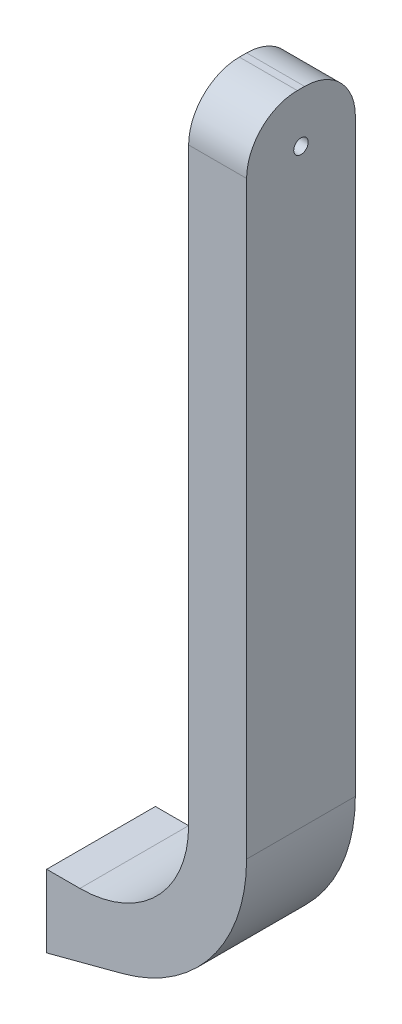
ISO-10303-21;
HEADER;
FILE_DESCRIPTION(('STEP AP214'),'2;1');
FILE_NAME('part.step','',(''),(''),'','','');
FILE_SCHEMA(('AUTOMOTIVE_DESIGN { 1 0 10303 214 1 1 1 1 }'));
ENDSEC;
DATA;
#1=APPLICATION_CONTEXT('core data for automotive mechanical design processes');
#2=APPLICATION_PROTOCOL_DEFINITION('international standard','automotive_design',2000,#1);
#3=PRODUCT_CONTEXT('',#1,'mechanical');
#4=PRODUCT('Part','Part','',(#3));
#5=PRODUCT_RELATED_PRODUCT_CATEGORY('part','',(#4));
#6=PRODUCT_DEFINITION_FORMATION('','',#4);
#7=PRODUCT_DEFINITION_CONTEXT('part definition',#1,'design');
#8=PRODUCT_DEFINITION('design','',#6,#7);
#9=PRODUCT_DEFINITION_SHAPE('','',#8);
#10=(LENGTH_UNIT() NAMED_UNIT(*) SI_UNIT(.MILLI.,.METRE.));
#11=(NAMED_UNIT(*) PLANE_ANGLE_UNIT() SI_UNIT($,.RADIAN.));
#12=(NAMED_UNIT(*) SI_UNIT($,.STERADIAN.) SOLID_ANGLE_UNIT());
#13=UNCERTAINTY_MEASURE_WITH_UNIT(LENGTH_MEASURE(1.E-05),#10,'distance_accuracy_value','');
#14=(GEOMETRIC_REPRESENTATION_CONTEXT(3) GLOBAL_UNCERTAINTY_ASSIGNED_CONTEXT((#13)) GLOBAL_UNIT_ASSIGNED_CONTEXT((#10,
#11,#12)) REPRESENTATION_CONTEXT('',''));
#15=CARTESIAN_POINT('',(0.,0.,0.));
#16=DIRECTION('',(0.,0.,1.));
#17=DIRECTION('',(1.,0.,0.));
#18=AXIS2_PLACEMENT_3D('',#15,#16,#17);
#19=CARTESIAN_POINT('',(96.8142284992855,422.253610620611,-131.630953187279));
#20=DIRECTION('',(-1.,0.,0.));
#21=DIRECTION('',(0.,0.,1.));
#22=AXIS2_PLACEMENT_3D('',#19,#20,#21);
#23=PLANE('',#22);
#24=DIRECTION('',(0.,1.,0.));
#25=VECTOR('',#24,1.);
#26=CARTESIAN_POINT('',(96.8142284992855,422.253610620611,-15.));
#27=LINE('',#26,#25);
#28=CARTESIAN_POINT('',(96.8142284992855,412.253610620621,-15.));
#29=VERTEX_POINT('',#28);
#30=CARTESIAN_POINT('',(96.8142284992855,422.253610620611,-15.));
#31=VERTEX_POINT('',#30);
#32=EDGE_CURVE('E117',#29,#31,#27,.T.);
#33=ORIENTED_EDGE('',*,*,#32,.F.);
#34=DIRECTION('',(0.,0.,1.));
#35=VECTOR('',#34,1.);
#36=CARTESIAN_POINT('',(96.8142284992855,412.253610620621,-131.630953187279));
#37=LINE('',#36,#35);
#38=CARTESIAN_POINT('',(96.8142284992855,412.253610620621,0.));
#39=VERTEX_POINT('',#38);
#40=EDGE_CURVE('E111',#29,#39,#37,.T.);
#41=ORIENTED_EDGE('',*,*,#40,.T.);
#42=DIRECTION('',(0.,-1.,0.));
#43=VECTOR('',#42,1.);
#44=CARTESIAN_POINT('',(96.8142284992855,422.253610620611,0.));
#45=LINE('',#44,#43);
#46=CARTESIAN_POINT('',(96.8142284992855,422.253610620611,0.));
#47=VERTEX_POINT('',#46);
#48=EDGE_CURVE('E115',#47,#39,#45,.T.);
#49=ORIENTED_EDGE('',*,*,#48,.F.);
#50=DIRECTION('',(0.,0.,1.));
#51=VECTOR('',#50,1.);
#52=CARTESIAN_POINT('',(96.8142284992855,422.253610620611,-131.630953187279));
#53=LINE('',#52,#51);
#54=EDGE_CURVE('E152',#31,#47,#53,.T.);
#55=ORIENTED_EDGE('',*,*,#54,.F.);
#56=EDGE_LOOP('',(#33,#41,#49,#55));
#57=FACE_BOUND('',#56,.T.);
#58=ADVANCED_FACE('F33',(#57),#23,.T.);
#59=CARTESIAN_POINT('',(96.8142284992855,422.253610620611,-131.630953187279));
#60=DIRECTION('',(0.,1.,0.));
#61=DIRECTION('',(0.,0.,1.));
#62=AXIS2_PLACEMENT_3D('',#59,#60,#61);
#63=PLANE('',#62);
#64=DIRECTION('',(1.,0.,0.));
#65=VECTOR('',#64,1.);
#66=CARTESIAN_POINT('',(96.8142284992855,422.253610620611,-15.));
#67=LINE('',#66,#65);
#68=CARTESIAN_POINT('',(101.396155955386,422.253610620611,-15.));
#69=VERTEX_POINT('',#68);
#70=EDGE_CURVE('E213',#31,#69,#67,.T.);
#71=ORIENTED_EDGE('',*,*,#70,.F.);
#72=ORIENTED_EDGE('',*,*,#54,.T.);
#73=DIRECTION('',(-1.,0.,0.));
#74=VECTOR('',#73,1.);
#75=CARTESIAN_POINT('',(96.8142284992855,422.253610620611,0.));
#76=LINE('',#75,#74);
#77=CARTESIAN_POINT('',(101.396155955386,422.253610620611,0.));
#78=VERTEX_POINT('',#77);
#79=EDGE_CURVE('E121',#78,#47,#76,.T.);
#80=ORIENTED_EDGE('',*,*,#79,.F.);
#81=DIRECTION('',(0.,0.,1.));
#82=VECTOR('',#81,1.);
#83=CARTESIAN_POINT('',(101.396155955386,422.253610620611,-131.630953187279));
#84=LINE('',#83,#82);
#85=EDGE_CURVE('E155',#69,#78,#84,.T.);
#86=ORIENTED_EDGE('',*,*,#85,.F.);
#87=EDGE_LOOP('',(#71,#72,#80,#86));
#88=FACE_BOUND('',#87,.T.);
#89=ADVANCED_FACE('F217',(#88),#63,.T.);
#90=CARTESIAN_POINT('',(101.396155955386,437.253610620611,-131.630953187279));
#91=DIRECTION('',(0.,0.,1.));
#92=DIRECTION('',(1.,0.,0.));
#93=AXIS2_PLACEMENT_3D('',#90,#91,#92);
#94=CYLINDRICAL_SURFACE('',#93,15.);
#95=CARTESIAN_POINT('',(101.396155955386,437.253610620611,-15.));
#96=DIRECTION('',(0.,0.,1.));
#97=DIRECTION('',(1.,0.,0.));
#98=AXIS2_PLACEMENT_3D('',#95,#96,#97);
#99=CIRCLE('',#98,15.);
#100=CARTESIAN_POINT('',(116.396155955386,437.253610620611,-15.));
#101=VERTEX_POINT('',#100);
#102=EDGE_CURVE('E194',#69,#101,#99,.T.);
#103=ORIENTED_EDGE('',*,*,#102,.F.);
#104=ORIENTED_EDGE('',*,*,#85,.T.);
#105=CARTESIAN_POINT('',(101.396155955386,437.253610620611,0.));
#106=DIRECTION('',(0.,0.,-1.));
#107=DIRECTION('',(1.,0.,0.));
#108=AXIS2_PLACEMENT_3D('',#105,#106,#107);
#109=CIRCLE('',#108,15.);
#110=CARTESIAN_POINT('',(116.396155955386,437.253610620611,0.));
#111=VERTEX_POINT('',#110);
#112=EDGE_CURVE('E149',#111,#78,#109,.T.);
#113=ORIENTED_EDGE('',*,*,#112,.F.);
#114=DIRECTION('',(0.,0.,1.));
#115=VECTOR('',#114,1.);
#116=CARTESIAN_POINT('',(116.396155955386,437.253610620611,-131.630953187279));
#117=LINE('',#116,#115);
#118=EDGE_CURVE('E157',#101,#111,#117,.T.);
#119=ORIENTED_EDGE('',*,*,#118,.F.);
#120=EDGE_LOOP('',(#103,#104,#113,#119));
#121=FACE_BOUND('',#120,.T.);
#122=ADVANCED_FACE('F220',(#121),#94,.F.);
#123=CARTESIAN_POINT('',(116.396155955386,437.253610620611,-131.630953187279));
#124=DIRECTION('',(-1.,0.,0.));
#125=DIRECTION('',(0.,0.,1.));
#126=AXIS2_PLACEMENT_3D('',#123,#124,#125);
#127=PLANE('',#126);
#128=CARTESIAN_POINT('',(116.396155955386,518.676232012742,-7.49999999996788));
#129=DIRECTION('',(-1.,0.,0.));
#130=DIRECTION('',(0.,0.,1.));
#131=AXIS2_PLACEMENT_3D('',#128,#129,#130);
#132=CIRCLE('',#131,1.00000000000003);
#133=CARTESIAN_POINT('',(116.396155955386,518.676232012742,-6.49999999996784));
#134=VERTEX_POINT('',#133);
#135=EDGE_CURVE('E139',#134,#134,#132,.T.);
#136=ORIENTED_EDGE('',*,*,#135,.F.);
#137=EDGE_LOOP('',(#136));
#138=FACE_BOUND('',#137,.T.);
#139=DIRECTION('',(0.,0.,1.));
#140=VECTOR('',#139,1.);
#141=CARTESIAN_POINT('',(116.396155955386,525.576232012732,-131.630953187279));
#142=LINE('',#141,#140);
#143=CARTESIAN_POINT('',(116.396155955386,525.576232012732,-8.00000000000001));
#144=VERTEX_POINT('',#143);
#145=CARTESIAN_POINT('',(116.396155955386,525.576232012732,-7.00000000000001));
#146=VERTEX_POINT('',#145);
#147=EDGE_CURVE('E160',#144,#146,#142,.T.);
#148=ORIENTED_EDGE('',*,*,#147,.F.);
#149=CARTESIAN_POINT('',(116.396155955386,518.576232012732,-8.));
#150=DIRECTION('',(-1.,0.,0.));
#151=DIRECTION('',(0.,0.,1.));
#152=AXIS2_PLACEMENT_3D('',#149,#150,#151);
#153=CIRCLE('',#152,7.);
#154=CARTESIAN_POINT('',(116.396155955386,518.576232012732,-15.));
#155=VERTEX_POINT('',#154);
#156=EDGE_CURVE('E41',#144,#155,#153,.T.);
#157=ORIENTED_EDGE('',*,*,#156,.T.);
#158=DIRECTION('',(0.,1.,0.));
#159=VECTOR('',#158,1.);
#160=CARTESIAN_POINT('',(116.396155955386,437.253610620611,-15.));
#161=LINE('',#160,#159);
#162=EDGE_CURVE('E185',#101,#155,#161,.T.);
#163=ORIENTED_EDGE('',*,*,#162,.F.);
#164=ORIENTED_EDGE('',*,*,#118,.T.);
#165=DIRECTION('',(0.,-1.,0.));
#166=VECTOR('',#165,1.);
#167=CARTESIAN_POINT('',(116.396155955386,437.253610620611,0.));
#168=LINE('',#167,#166);
#169=CARTESIAN_POINT('',(116.396155955386,518.576232012732,0.));
#170=VERTEX_POINT('',#169);
#171=EDGE_CURVE('E147',#170,#111,#168,.T.);
#172=ORIENTED_EDGE('',*,*,#171,.F.);
#173=CARTESIAN_POINT('',(116.396155955386,518.576232012732,-7.));
#174=DIRECTION('',(-1.,0.,0.));
#175=DIRECTION('',(0.,0.,1.));
#176=AXIS2_PLACEMENT_3D('',#173,#174,#175);
#177=CIRCLE('',#176,7.);
#178=EDGE_CURVE('E48',#170,#146,#177,.T.);
#179=ORIENTED_EDGE('',*,*,#178,.T.);
#180=EDGE_LOOP('',(#148,#157,#163,#164,#172,#179));
#181=FACE_BOUND('',#180,.T.);
#182=ADVANCED_FACE('F184',(#138,#181),#127,.T.);
#183=CARTESIAN_POINT('',(124.396155955386,525.576232012732,-131.630953187279));
#184=DIRECTION('',(0.,1.,0.));
#185=DIRECTION('',(0.,0.,1.));
#186=AXIS2_PLACEMENT_3D('',#183,#184,#185);
#187=PLANE('',#186);
#188=DIRECTION('',(0.,0.,1.));
#189=VECTOR('',#188,1.);
#190=CARTESIAN_POINT('',(124.396155955386,525.576232012732,-131.630953187279));
#191=LINE('',#190,#189);
#192=CARTESIAN_POINT('',(124.396155955386,525.576232012732,-8.00000000000001));
#193=VERTEX_POINT('',#192);
#194=CARTESIAN_POINT('',(124.396155955386,525.576232012732,-7.00000000000001));
#195=VERTEX_POINT('',#194);
#196=EDGE_CURVE('E162',#193,#195,#191,.T.);
#197=ORIENTED_EDGE('',*,*,#196,.F.);
#198=DIRECTION('',(1.,0.,0.));
#199=VECTOR('',#198,1.);
#200=CARTESIAN_POINT('',(116.396155955386,525.576232012732,-8.));
#201=LINE('',#200,#199);
#202=EDGE_CURVE('E179',#193,#144,#201,.F.);
#203=ORIENTED_EDGE('',*,*,#202,.T.);
#204=ORIENTED_EDGE('',*,*,#147,.T.);
#205=DIRECTION('',(-1.,0.,0.));
#206=VECTOR('',#205,1.);
#207=CARTESIAN_POINT('',(124.396155955386,525.576232012732,-7.00000000000001));
#208=LINE('',#207,#206);
#209=EDGE_CURVE('E177',#146,#195,#208,.F.);
#210=ORIENTED_EDGE('',*,*,#209,.T.);
#211=EDGE_LOOP('',(#197,#203,#204,#210));
#212=FACE_BOUND('',#211,.T.);
#213=ADVANCED_FACE('F204',(#212),#187,.T.);
#214=CARTESIAN_POINT('',(124.396155955386,437.253610620611,-131.630953187279));
#215=DIRECTION('',(1.,0.,0.));
#216=DIRECTION('',(0.,1.,0.));
#217=AXIS2_PLACEMENT_3D('',#214,#215,#216);
#218=PLANE('',#217);
#219=CARTESIAN_POINT('',(124.396155955386,518.676232012742,-7.49999999996788));
#220=DIRECTION('',(1.,0.,0.));
#221=DIRECTION('',(0.,1.,0.));
#222=AXIS2_PLACEMENT_3D('',#219,#220,#221);
#223=CIRCLE('',#222,1.00000000000003);
#224=CARTESIAN_POINT('',(124.396155955386,519.676232012742,-7.49999999996788));
#225=VERTEX_POINT('',#224);
#226=EDGE_CURVE('E136',#225,#225,#223,.F.);
#227=ORIENTED_EDGE('',*,*,#226,.T.);
#228=EDGE_LOOP('',(#227));
#229=FACE_BOUND('',#228,.T.);
#230=DIRECTION('',(0.,-1.,0.));
#231=VECTOR('',#230,1.);
#232=CARTESIAN_POINT('',(124.396155955386,437.253610620611,-15.));
#233=LINE('',#232,#231);
#234=CARTESIAN_POINT('',(124.396155955386,518.576232012732,-15.));
#235=VERTEX_POINT('',#234);
#236=CARTESIAN_POINT('',(124.396155955386,437.253610620611,-15.));
#237=VERTEX_POINT('',#236);
#238=EDGE_CURVE('E195',#235,#237,#233,.T.);
#239=ORIENTED_EDGE('',*,*,#238,.F.);
#240=CARTESIAN_POINT('',(124.396155955386,518.576232012732,-8.));
#241=DIRECTION('',(1.,0.,0.));
#242=DIRECTION('',(0.,1.,0.));
#243=AXIS2_PLACEMENT_3D('',#240,#241,#242);
#244=CIRCLE('',#243,7.);
#245=EDGE_CURVE('E175',#235,#193,#244,.T.);
#246=ORIENTED_EDGE('',*,*,#245,.T.);
#247=ORIENTED_EDGE('',*,*,#196,.T.);
#248=CARTESIAN_POINT('',(124.396155955386,518.576232012732,-7.));
#249=DIRECTION('',(1.,0.,0.));
#250=DIRECTION('',(0.,1.,0.));
#251=AXIS2_PLACEMENT_3D('',#248,#249,#250);
#252=CIRCLE('',#251,7.);
#253=CARTESIAN_POINT('',(124.396155955386,518.576232012732,0.));
#254=VERTEX_POINT('',#253);
#255=EDGE_CURVE('E173',#195,#254,#252,.T.);
#256=ORIENTED_EDGE('',*,*,#255,.T.);
#257=DIRECTION('',(0.,1.,0.));
#258=VECTOR('',#257,1.);
#259=CARTESIAN_POINT('',(124.396155955386,437.253610620611,0.));
#260=LINE('',#259,#258);
#261=CARTESIAN_POINT('',(124.396155955386,437.253610620611,0.));
#262=VERTEX_POINT('',#261);
#263=EDGE_CURVE('E145',#262,#254,#260,.T.);
#264=ORIENTED_EDGE('',*,*,#263,.F.);
#265=DIRECTION('',(0.,0.,1.));
#266=VECTOR('',#265,1.);
#267=CARTESIAN_POINT('',(124.396155955386,437.253610620611,-131.630953187279));
#268=LINE('',#267,#266);
#269=EDGE_CURVE('E165',#237,#262,#268,.T.);
#270=ORIENTED_EDGE('',*,*,#269,.F.);
#271=EDGE_LOOP('',(#239,#246,#247,#256,#264,#270));
#272=FACE_BOUND('',#271,.T.);
#273=ADVANCED_FACE('F200',(#229,#272),#218,.T.);
#274=CARTESIAN_POINT('',(101.396155955386,437.253610620611,-131.630953187279));
#275=DIRECTION('',(0.,0.,1.));
#276=DIRECTION('',(1.,0.,0.));
#277=AXIS2_PLACEMENT_3D('',#274,#275,#276);
#278=CYLINDRICAL_SURFACE('',#277,23.);
#279=CARTESIAN_POINT('',(101.396155955386,437.253610620611,-15.));
#280=DIRECTION('',(0.,0.,1.));
#281=DIRECTION('',(1.,0.,0.));
#282=AXIS2_PLACEMENT_3D('',#279,#280,#281);
#283=CIRCLE('',#282,23.);
#284=CARTESIAN_POINT('',(107.271718380901,415.016754588701,-15.));
#285=VERTEX_POINT('',#284);
#286=EDGE_CURVE('E154',#237,#285,#283,.F.);
#287=ORIENTED_EDGE('',*,*,#286,.F.);
#288=ORIENTED_EDGE('',*,*,#269,.T.);
#289=CARTESIAN_POINT('',(101.396155955386,437.253610620611,0.));
#290=DIRECTION('',(0.,0.,1.));
#291=DIRECTION('',(1.,0.,0.));
#292=AXIS2_PLACEMENT_3D('',#289,#290,#291);
#293=CIRCLE('',#292,23.);
#294=CARTESIAN_POINT('',(107.271718380901,415.016754588701,0.));
#295=VERTEX_POINT('',#294);
#296=EDGE_CURVE('E130',#295,#262,#293,.T.);
#297=ORIENTED_EDGE('',*,*,#296,.F.);
#298=DIRECTION('',(0.,0.,1.));
#299=VECTOR('',#298,1.);
#300=CARTESIAN_POINT('',(107.271718380901,415.016754588701,-131.630953187279));
#301=LINE('',#300,#299);
#302=EDGE_CURVE('E120',#285,#295,#301,.T.);
#303=ORIENTED_EDGE('',*,*,#302,.F.);
#304=EDGE_LOOP('',(#287,#288,#297,#303));
#305=FACE_BOUND('',#304,.T.);
#306=ADVANCED_FACE('F208',(#305),#278,.T.);
#307=CARTESIAN_POINT('',(96.8142284992855,412.253610620621,-131.630953187279));
#308=DIRECTION('',(0.255459235891951,-0.966819827474334,0.));
#309=DIRECTION('',(0.966819827474334,0.255459235891951,0.));
#310=AXIS2_PLACEMENT_3D('',#307,#308,#309);
#311=PLANE('',#310);
#312=DIRECTION('',(-0.966819827474334,-0.255459235891951,0.));
#313=VECTOR('',#312,1.);
#314=CARTESIAN_POINT('',(96.8142284992855,412.253610620621,-15.));
#315=LINE('',#314,#313);
#316=EDGE_CURVE('E168',#285,#29,#315,.T.);
#317=ORIENTED_EDGE('',*,*,#316,.F.);
#318=ORIENTED_EDGE('',*,*,#302,.T.);
#319=DIRECTION('',(0.966819827474334,0.255459235891951,0.));
#320=VECTOR('',#319,1.);
#321=CARTESIAN_POINT('',(96.8142284992855,412.253610620621,0.));
#322=LINE('',#321,#320);
#323=EDGE_CURVE('E124',#39,#295,#322,.T.);
#324=ORIENTED_EDGE('',*,*,#323,.F.);
#325=ORIENTED_EDGE('',*,*,#40,.F.);
#326=EDGE_LOOP('',(#317,#318,#324,#325));
#327=FACE_BOUND('',#326,.T.);
#328=ADVANCED_FACE('F125',(#327),#311,.T.);
#329=CARTESIAN_POINT('',(101.396155955386,437.253610620611,0.));
#330=DIRECTION('',(0.,0.,1.));
#331=DIRECTION('',(1.,0.,0.));
#332=AXIS2_PLACEMENT_3D('',#329,#330,#331);
#333=PLANE('',#332);
#334=ORIENTED_EDGE('',*,*,#263,.T.);
#335=DIRECTION('',(-1.,0.,0.));
#336=VECTOR('',#335,1.);
#337=CARTESIAN_POINT('',(101.396155955386,518.576232012732,0.));
#338=LINE('',#337,#336);
#339=EDGE_CURVE('E11',#254,#170,#338,.T.);
#340=ORIENTED_EDGE('',*,*,#339,.T.);
#341=ORIENTED_EDGE('',*,*,#171,.T.);
#342=ORIENTED_EDGE('',*,*,#112,.T.);
#343=ORIENTED_EDGE('',*,*,#79,.T.);
#344=ORIENTED_EDGE('',*,*,#48,.T.);
#345=ORIENTED_EDGE('',*,*,#323,.T.);
#346=ORIENTED_EDGE('',*,*,#296,.T.);
#347=EDGE_LOOP('',(#334,#340,#341,#342,#343,#344,#345,#346));
#348=FACE_BOUND('',#347,.T.);
#349=ADVANCED_FACE('F133',(#348),#333,.T.);
#350=CARTESIAN_POINT('',(0.,0.,-15.));
#351=DIRECTION('',(0.,0.,1.));
#352=DIRECTION('',(1.,0.,0.));
#353=AXIS2_PLACEMENT_3D('',#350,#351,#352);
#354=PLANE('',#353);
#355=ORIENTED_EDGE('',*,*,#162,.T.);
#356=DIRECTION('',(1.,0.,0.));
#357=VECTOR('',#356,1.);
#358=CARTESIAN_POINT('',(124.396155955386,518.576232012732,-15.));
#359=LINE('',#358,#357);
#360=EDGE_CURVE('E170',#155,#235,#359,.T.);
#361=ORIENTED_EDGE('',*,*,#360,.T.);
#362=ORIENTED_EDGE('',*,*,#238,.T.);
#363=ORIENTED_EDGE('',*,*,#286,.T.);
#364=ORIENTED_EDGE('',*,*,#316,.T.);
#365=ORIENTED_EDGE('',*,*,#32,.T.);
#366=ORIENTED_EDGE('',*,*,#70,.T.);
#367=ORIENTED_EDGE('',*,*,#102,.T.);
#368=EDGE_LOOP('',(#355,#361,#362,#363,#364,#365,#366,#367));
#369=FACE_BOUND('',#368,.T.);
#370=ADVANCED_FACE('F191',(#369),#354,.F.);
#371=CARTESIAN_POINT('',(0.,518.576232012732,-8.));
#372=DIRECTION('',(-1.,0.,0.));
#373=DIRECTION('',(0.,0.,1.));
#374=AXIS2_PLACEMENT_3D('',#371,#372,#373);
#375=CYLINDRICAL_SURFACE('',#374,7.);
#376=ORIENTED_EDGE('',*,*,#156,.F.);
#377=ORIENTED_EDGE('',*,*,#202,.F.);
#378=ORIENTED_EDGE('',*,*,#245,.F.);
#379=ORIENTED_EDGE('',*,*,#360,.F.);
#380=EDGE_LOOP('',(#376,#377,#378,#379));
#381=FACE_BOUND('',#380,.T.);
#382=ADVANCED_FACE('F197',(#381),#375,.T.);
#383=CARTESIAN_POINT('',(101.396155955386,518.576232012732,-7.));
#384=DIRECTION('',(-1.,0.,0.));
#385=DIRECTION('',(0.,0.,1.));
#386=AXIS2_PLACEMENT_3D('',#383,#384,#385);
#387=CYLINDRICAL_SURFACE('',#386,7.);
#388=ORIENTED_EDGE('',*,*,#255,.F.);
#389=ORIENTED_EDGE('',*,*,#209,.F.);
#390=ORIENTED_EDGE('',*,*,#178,.F.);
#391=ORIENTED_EDGE('',*,*,#339,.F.);
#392=EDGE_LOOP('',(#388,#389,#390,#391));
#393=FACE_BOUND('',#392,.T.);
#394=ADVANCED_FACE('F35',(#393),#387,.T.);
#395=CARTESIAN_POINT('',(127.224583080133,518.676232012742,-7.49999999996788));
#396=DIRECTION('',(-1.,0.,0.));
#397=DIRECTION('',(0.,0.,1.));
#398=AXIS2_PLACEMENT_3D('',#395,#396,#397);
#399=CYLINDRICAL_SURFACE('',#398,1.00000000000003);
#400=ORIENTED_EDGE('',*,*,#135,.T.);
#401=EDGE_LOOP('',(#400));
#402=FACE_BOUND('',#401,.T.);
#403=ORIENTED_EDGE('',*,*,#226,.F.);
#404=EDGE_LOOP('',(#403));
#405=FACE_BOUND('',#404,.T.);
#406=ADVANCED_FACE('F241',(#402,#405),#399,.F.);
#407=CLOSED_SHELL('',(#58,#89,#122,#182,#213,#273,#306,#328,#349,#370,#382,#394,#406));
#408=MANIFOLD_SOLID_BREP('B2',#407);
#409=ADVANCED_BREP_SHAPE_REPRESENTATION('',(#18,#408),#14);
#410=SHAPE_DEFINITION_REPRESENTATION(#9,#409);
ENDSEC;
END-ISO-10303-21;
